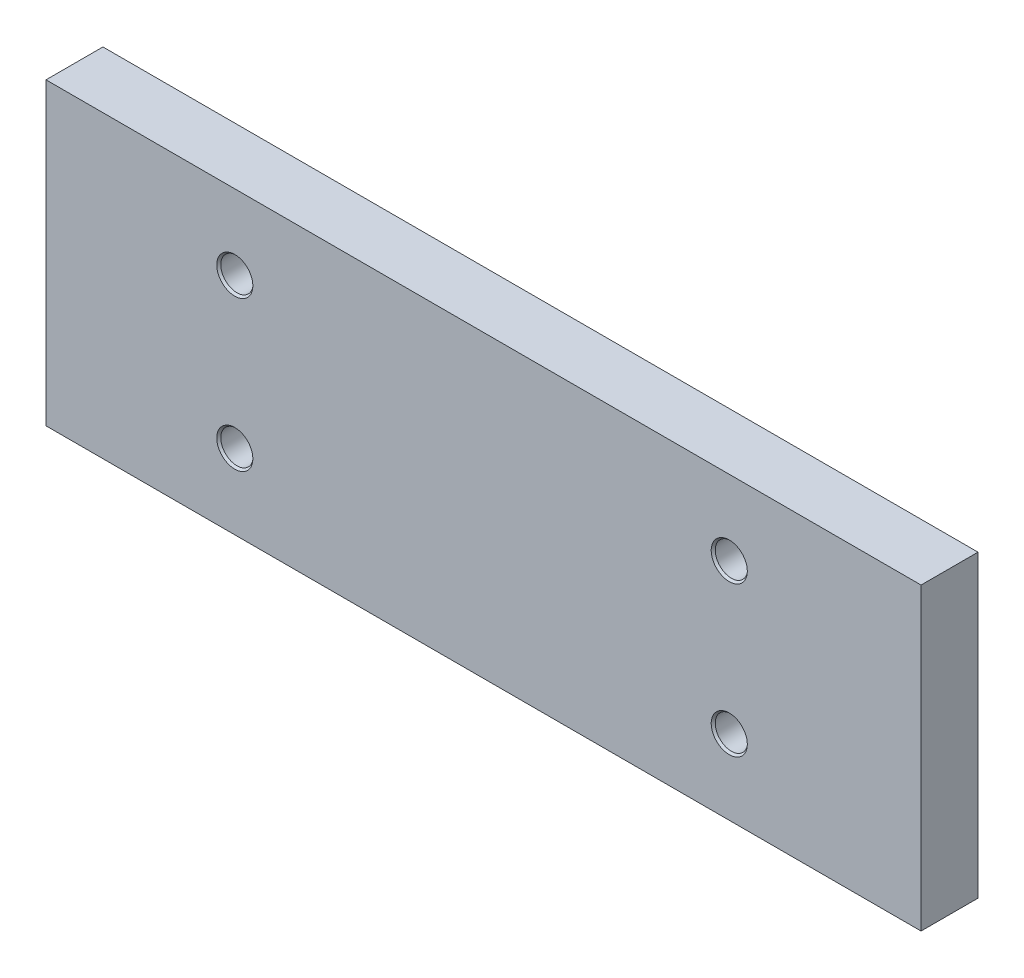
ISO-10303-21;
HEADER;
FILE_DESCRIPTION(('STEP AP214'),'2;1');
FILE_NAME('part.step','',(''),(''),'','','');
FILE_SCHEMA(('AUTOMOTIVE_DESIGN { 1 0 10303 214 1 1 1 1 }'));
ENDSEC;
DATA;
#1=APPLICATION_CONTEXT('core data for automotive mechanical design processes');
#2=APPLICATION_PROTOCOL_DEFINITION('international standard','automotive_design',2000,#1);
#3=PRODUCT_CONTEXT('',#1,'mechanical');
#4=PRODUCT('Part','Part','',(#3));
#5=PRODUCT_RELATED_PRODUCT_CATEGORY('part','',(#4));
#6=PRODUCT_DEFINITION_FORMATION('','',#4);
#7=PRODUCT_DEFINITION_CONTEXT('part definition',#1,'design');
#8=PRODUCT_DEFINITION('design','',#6,#7);
#9=PRODUCT_DEFINITION_SHAPE('','',#8);
#10=(LENGTH_UNIT() NAMED_UNIT(*) SI_UNIT(.MILLI.,.METRE.));
#11=(NAMED_UNIT(*) PLANE_ANGLE_UNIT() SI_UNIT($,.RADIAN.));
#12=(NAMED_UNIT(*) SI_UNIT($,.STERADIAN.) SOLID_ANGLE_UNIT());
#13=UNCERTAINTY_MEASURE_WITH_UNIT(LENGTH_MEASURE(1.E-05),#10,'distance_accuracy_value','');
#14=(GEOMETRIC_REPRESENTATION_CONTEXT(3) GLOBAL_UNCERTAINTY_ASSIGNED_CONTEXT((#13)) GLOBAL_UNIT_ASSIGNED_CONTEXT((#10,
#11,#12)) REPRESENTATION_CONTEXT('',''));
#15=CARTESIAN_POINT('',(0.,0.,0.));
#16=DIRECTION('',(0.,0.,1.));
#17=DIRECTION('',(1.,0.,0.));
#18=AXIS2_PLACEMENT_3D('',#15,#16,#17);
#19=CARTESIAN_POINT('',(177.207100591716,45.2662721893492,19.));
#20=DIRECTION('',(0.,-1.,0.));
#21=DIRECTION('',(1.,0.,0.));
#22=AXIS2_PLACEMENT_3D('',#19,#20,#21);
#23=PLANE('',#22);
#24=DIRECTION('',(-1.,0.,0.));
#25=VECTOR('',#24,1.);
#26=CARTESIAN_POINT('',(177.207100591716,45.2662721893492,0.));
#27=LINE('',#26,#25);
#28=CARTESIAN_POINT('',(177.207100591716,45.2662721893492,0.));
#29=VERTEX_POINT('',#28);
#30=CARTESIAN_POINT('',(-114.792899408284,45.2662721893491,0.));
#31=VERTEX_POINT('',#30);
#32=EDGE_CURVE('E111',#29,#31,#27,.T.);
#33=ORIENTED_EDGE('',*,*,#32,.T.);
#34=DIRECTION('',(0.,0.,-1.));
#35=VECTOR('',#34,1.);
#36=CARTESIAN_POINT('',(-114.792899408284,45.2662721893491,19.));
#37=LINE('',#36,#35);
#38=CARTESIAN_POINT('',(-114.792899408284,45.2662721893491,19.));
#39=VERTEX_POINT('',#38);
#40=EDGE_CURVE('E11',#39,#31,#37,.T.);
#41=ORIENTED_EDGE('',*,*,#40,.F.);
#42=DIRECTION('',(-1.,0.,0.));
#43=VECTOR('',#42,1.);
#44=CARTESIAN_POINT('',(177.207100591716,45.2662721893492,19.));
#45=LINE('',#44,#43);
#46=CARTESIAN_POINT('',(177.207100591716,45.2662721893492,19.));
#47=VERTEX_POINT('',#46);
#48=EDGE_CURVE('E95',#47,#39,#45,.T.);
#49=ORIENTED_EDGE('',*,*,#48,.F.);
#50=DIRECTION('',(0.,0.,-1.));
#51=VECTOR('',#50,1.);
#52=CARTESIAN_POINT('',(177.207100591716,45.2662721893492,19.));
#53=LINE('',#52,#51);
#54=EDGE_CURVE('E107',#47,#29,#53,.T.);
#55=ORIENTED_EDGE('',*,*,#54,.T.);
#56=EDGE_LOOP('',(#33,#41,#49,#55));
#57=FACE_BOUND('',#56,.T.);
#58=ADVANCED_FACE('F43',(#57),#23,.F.);
#59=CARTESIAN_POINT('',(-114.792899408284,45.2662721893491,19.));
#60=DIRECTION('',(1.,0.,0.));
#61=DIRECTION('',(0.,0.,-1.));
#62=AXIS2_PLACEMENT_3D('',#59,#60,#61);
#63=PLANE('',#62);
#64=DIRECTION('',(0.,-1.,0.));
#65=VECTOR('',#64,1.);
#66=CARTESIAN_POINT('',(-114.792899408284,45.2662721893491,0.));
#67=LINE('',#66,#65);
#68=CARTESIAN_POINT('',(-114.792899408284,-54.7337278106509,0.));
#69=VERTEX_POINT('',#68);
#70=EDGE_CURVE('E100',#31,#69,#67,.T.);
#71=ORIENTED_EDGE('',*,*,#70,.T.);
#72=DIRECTION('',(0.,0.,-1.));
#73=VECTOR('',#72,1.);
#74=CARTESIAN_POINT('',(-114.792899408284,-54.7337278106509,19.));
#75=LINE('',#74,#73);
#76=CARTESIAN_POINT('',(-114.792899408284,-54.7337278106509,19.));
#77=VERTEX_POINT('',#76);
#78=EDGE_CURVE('E52',#77,#69,#75,.T.);
#79=ORIENTED_EDGE('',*,*,#78,.F.);
#80=DIRECTION('',(0.,-1.,0.));
#81=VECTOR('',#80,1.);
#82=CARTESIAN_POINT('',(-114.792899408284,45.2662721893491,19.));
#83=LINE('',#82,#81);
#84=EDGE_CURVE('E90',#39,#77,#83,.T.);
#85=ORIENTED_EDGE('',*,*,#84,.F.);
#86=ORIENTED_EDGE('',*,*,#40,.T.);
#87=EDGE_LOOP('',(#71,#79,#85,#86));
#88=FACE_BOUND('',#87,.T.);
#89=ADVANCED_FACE('F99',(#88),#63,.F.);
#90=CARTESIAN_POINT('',(-114.792899408284,-54.7337278106509,19.));
#91=DIRECTION('',(0.,1.,0.));
#92=DIRECTION('',(0.,0.,1.));
#93=AXIS2_PLACEMENT_3D('',#90,#91,#92);
#94=PLANE('',#93);
#95=DIRECTION('',(1.,0.,0.));
#96=VECTOR('',#95,1.);
#97=CARTESIAN_POINT('',(-114.792899408284,-54.7337278106509,0.));
#98=LINE('',#97,#96);
#99=CARTESIAN_POINT('',(177.207100591716,-54.7337278106509,0.));
#100=VERTEX_POINT('',#99);
#101=EDGE_CURVE('E77',#69,#100,#98,.T.);
#102=ORIENTED_EDGE('',*,*,#101,.T.);
#103=DIRECTION('',(0.,0.,-1.));
#104=VECTOR('',#103,1.);
#105=CARTESIAN_POINT('',(177.207100591716,-54.7337278106509,19.));
#106=LINE('',#105,#104);
#107=CARTESIAN_POINT('',(177.207100591716,-54.7337278106509,19.));
#108=VERTEX_POINT('',#107);
#109=EDGE_CURVE('E102',#108,#100,#106,.T.);
#110=ORIENTED_EDGE('',*,*,#109,.F.);
#111=DIRECTION('',(1.,0.,0.));
#112=VECTOR('',#111,1.);
#113=CARTESIAN_POINT('',(-114.792899408284,-54.7337278106509,19.));
#114=LINE('',#113,#112);
#115=EDGE_CURVE('E93',#77,#108,#114,.T.);
#116=ORIENTED_EDGE('',*,*,#115,.F.);
#117=ORIENTED_EDGE('',*,*,#78,.T.);
#118=EDGE_LOOP('',(#102,#110,#116,#117));
#119=FACE_BOUND('',#118,.T.);
#120=ADVANCED_FACE('F103',(#119),#94,.F.);
#121=CARTESIAN_POINT('',(177.207100591716,-54.7337278106509,19.));
#122=DIRECTION('',(-1.,0.,0.));
#123=DIRECTION('',(0.,0.,1.));
#124=AXIS2_PLACEMENT_3D('',#121,#122,#123);
#125=PLANE('',#124);
#126=DIRECTION('',(0.,1.,0.));
#127=VECTOR('',#126,1.);
#128=CARTESIAN_POINT('',(177.207100591716,-54.7337278106509,0.));
#129=LINE('',#128,#127);
#130=EDGE_CURVE('E83',#100,#29,#129,.T.);
#131=ORIENTED_EDGE('',*,*,#130,.T.);
#132=ORIENTED_EDGE('',*,*,#54,.F.);
#133=DIRECTION('',(0.,1.,0.));
#134=VECTOR('',#133,1.);
#135=CARTESIAN_POINT('',(177.207100591716,-54.7337278106509,19.));
#136=LINE('',#135,#134);
#137=EDGE_CURVE('E60',#108,#47,#136,.T.);
#138=ORIENTED_EDGE('',*,*,#137,.F.);
#139=ORIENTED_EDGE('',*,*,#109,.T.);
#140=EDGE_LOOP('',(#131,#132,#138,#139));
#141=FACE_BOUND('',#140,.T.);
#142=ADVANCED_FACE('F125',(#141),#125,.F.);
#143=CARTESIAN_POINT('',(0.,0.,19.));
#144=DIRECTION('',(0.,0.,1.));
#145=DIRECTION('',(1.,0.,0.));
#146=AXIS2_PLACEMENT_3D('',#143,#144,#145);
#147=PLANE('',#146);
#148=CARTESIAN_POINT('',(-51.792899408284,20.2662721893491,19.));
#149=DIRECTION('',(0.,0.,1.));
#150=DIRECTION('',(1.,0.,0.));
#151=AXIS2_PLACEMENT_3D('',#148,#149,#150);
#152=CIRCLE('',#151,6.025);
#153=CARTESIAN_POINT('',(-45.767899408284,20.2662721893491,19.));
#154=VERTEX_POINT('',#153);
#155=EDGE_CURVE('E175',#154,#154,#152,.T.);
#156=ORIENTED_EDGE('',*,*,#155,.F.);
#157=EDGE_LOOP('',(#156));
#158=FACE_BOUND('',#157,.T.);
#159=CARTESIAN_POINT('',(-51.792899408284,-29.7337278106509,19.));
#160=DIRECTION('',(0.,0.,1.));
#161=DIRECTION('',(1.,0.,0.));
#162=AXIS2_PLACEMENT_3D('',#159,#160,#161);
#163=CIRCLE('',#162,6.025);
#164=CARTESIAN_POINT('',(-45.767899408284,-29.7337278106509,19.));
#165=VERTEX_POINT('',#164);
#166=EDGE_CURVE('E163',#165,#165,#163,.T.);
#167=ORIENTED_EDGE('',*,*,#166,.F.);
#168=EDGE_LOOP('',(#167));
#169=FACE_BOUND('',#168,.T.);
#170=CARTESIAN_POINT('',(113.207100591716,-29.7337278106509,19.));
#171=DIRECTION('',(0.,0.,1.));
#172=DIRECTION('',(1.,0.,0.));
#173=AXIS2_PLACEMENT_3D('',#170,#171,#172);
#174=CIRCLE('',#173,6.025);
#175=CARTESIAN_POINT('',(119.232100591716,-29.7337278106509,19.));
#176=VERTEX_POINT('',#175);
#177=EDGE_CURVE('E151',#176,#176,#174,.T.);
#178=ORIENTED_EDGE('',*,*,#177,.F.);
#179=EDGE_LOOP('',(#178));
#180=FACE_BOUND('',#179,.T.);
#181=CARTESIAN_POINT('',(113.207100591716,20.2662721893491,19.));
#182=DIRECTION('',(0.,0.,1.));
#183=DIRECTION('',(1.,0.,0.));
#184=AXIS2_PLACEMENT_3D('',#181,#182,#183);
#185=CIRCLE('',#184,6.025);
#186=CARTESIAN_POINT('',(119.232100591716,20.2662721893491,19.));
#187=VERTEX_POINT('',#186);
#188=EDGE_CURVE('E139',#187,#187,#185,.T.);
#189=ORIENTED_EDGE('',*,*,#188,.F.);
#190=EDGE_LOOP('',(#189));
#191=FACE_BOUND('',#190,.T.);
#192=ORIENTED_EDGE('',*,*,#48,.T.);
#193=ORIENTED_EDGE('',*,*,#84,.T.);
#194=ORIENTED_EDGE('',*,*,#115,.T.);
#195=ORIENTED_EDGE('',*,*,#137,.T.);
#196=EDGE_LOOP('',(#192,#193,#194,#195));
#197=FACE_BOUND('',#196,.T.);
#198=ADVANCED_FACE('F91',(#158,#169,#180,#191,#197),#147,.T.);
#199=CARTESIAN_POINT('',(0.,0.,0.));
#200=DIRECTION('',(0.,0.,1.));
#201=DIRECTION('',(1.,0.,0.));
#202=AXIS2_PLACEMENT_3D('',#199,#200,#201);
#203=PLANE('',#202);
#204=CARTESIAN_POINT('',(-51.792899408284,20.2662721893491,0.));
#205=DIRECTION('',(0.,0.,1.));
#206=DIRECTION('',(1.,0.,0.));
#207=AXIS2_PLACEMENT_3D('',#204,#205,#206);
#208=CIRCLE('',#207,5.4);
#209=CARTESIAN_POINT('',(-46.392899408284,20.2662721893491,0.));
#210=VERTEX_POINT('',#209);
#211=EDGE_CURVE('E167',#210,#210,#208,.T.);
#212=ORIENTED_EDGE('',*,*,#211,.T.);
#213=EDGE_LOOP('',(#212));
#214=FACE_BOUND('',#213,.T.);
#215=CARTESIAN_POINT('',(-51.792899408284,-29.7337278106509,0.));
#216=DIRECTION('',(0.,0.,1.));
#217=DIRECTION('',(1.,0.,0.));
#218=AXIS2_PLACEMENT_3D('',#215,#216,#217);
#219=CIRCLE('',#218,5.4);
#220=CARTESIAN_POINT('',(-46.392899408284,-29.7337278106509,0.));
#221=VERTEX_POINT('',#220);
#222=EDGE_CURVE('E155',#221,#221,#219,.T.);
#223=ORIENTED_EDGE('',*,*,#222,.T.);
#224=EDGE_LOOP('',(#223));
#225=FACE_BOUND('',#224,.T.);
#226=CARTESIAN_POINT('',(113.207100591716,-29.7337278106509,0.));
#227=DIRECTION('',(0.,0.,1.));
#228=DIRECTION('',(1.,0.,0.));
#229=AXIS2_PLACEMENT_3D('',#226,#227,#228);
#230=CIRCLE('',#229,5.4);
#231=CARTESIAN_POINT('',(118.607100591716,-29.7337278106509,0.));
#232=VERTEX_POINT('',#231);
#233=EDGE_CURVE('E143',#232,#232,#230,.T.);
#234=ORIENTED_EDGE('',*,*,#233,.T.);
#235=EDGE_LOOP('',(#234));
#236=FACE_BOUND('',#235,.T.);
#237=CARTESIAN_POINT('',(113.207100591716,20.2662721893491,0.));
#238=DIRECTION('',(0.,0.,1.));
#239=DIRECTION('',(1.,0.,0.));
#240=AXIS2_PLACEMENT_3D('',#237,#238,#239);
#241=CIRCLE('',#240,5.4);
#242=CARTESIAN_POINT('',(118.607100591716,20.2662721893491,0.));
#243=VERTEX_POINT('',#242);
#244=EDGE_CURVE('E115',#243,#243,#241,.T.);
#245=ORIENTED_EDGE('',*,*,#244,.T.);
#246=EDGE_LOOP('',(#245));
#247=FACE_BOUND('',#246,.T.);
#248=ORIENTED_EDGE('',*,*,#32,.F.);
#249=ORIENTED_EDGE('',*,*,#130,.F.);
#250=ORIENTED_EDGE('',*,*,#101,.F.);
#251=ORIENTED_EDGE('',*,*,#70,.F.);
#252=EDGE_LOOP('',(#248,#249,#250,#251));
#253=FACE_BOUND('',#252,.T.);
#254=ADVANCED_FACE('F128',(#214,#225,#236,#247,#253),#203,.F.);
#255=CARTESIAN_POINT('',(113.207100591716,20.2662721893491,19.));
#256=DIRECTION('',(0.,0.,1.));
#257=DIRECTION('',(1.,0.,0.));
#258=AXIS2_PLACEMENT_3D('',#255,#256,#257);
#259=CYLINDRICAL_SURFACE('',#258,5.4);
#260=ORIENTED_EDGE('',*,*,#244,.F.);
#261=EDGE_LOOP('',(#260));
#262=FACE_BOUND('',#261,.T.);
#263=CARTESIAN_POINT('',(113.207100591716,20.2662721893491,18.2810197454869));
#264=DIRECTION('',(0.,0.,1.));
#265=DIRECTION('',(1.,0.,0.));
#266=AXIS2_PLACEMENT_3D('',#263,#264,#265);
#267=CIRCLE('',#266,5.4);
#268=CARTESIAN_POINT('',(118.607100591716,20.2662721893491,18.2810197454869));
#269=VERTEX_POINT('',#268);
#270=EDGE_CURVE('E135',#269,#269,#267,.T.);
#271=ORIENTED_EDGE('',*,*,#270,.T.);
#272=EDGE_LOOP('',(#271));
#273=FACE_BOUND('',#272,.T.);
#274=ADVANCED_FACE('F194',(#262,#273),#259,.F.);
#275=CARTESIAN_POINT('',(113.207100591716,20.2662721893491,19.));
#276=DIRECTION('',(0.,0.,1.));
#277=DIRECTION('',(1.,0.,0.));
#278=AXIS2_PLACEMENT_3D('',#275,#276,#277);
#279=CONICAL_SURFACE('',#278,6.025,0.715584993317676);
#280=ORIENTED_EDGE('',*,*,#270,.F.);
#281=EDGE_LOOP('',(#280));
#282=FACE_BOUND('',#281,.T.);
#283=ORIENTED_EDGE('',*,*,#188,.T.);
#284=EDGE_LOOP('',(#283));
#285=FACE_BOUND('',#284,.T.);
#286=ADVANCED_FACE('F191',(#282,#285),#279,.F.);
#287=CARTESIAN_POINT('',(113.207100591716,-29.7337278106509,19.));
#288=DIRECTION('',(0.,0.,1.));
#289=DIRECTION('',(1.,0.,0.));
#290=AXIS2_PLACEMENT_3D('',#287,#288,#289);
#291=CYLINDRICAL_SURFACE('',#290,5.4);
#292=ORIENTED_EDGE('',*,*,#233,.F.);
#293=EDGE_LOOP('',(#292));
#294=FACE_BOUND('',#293,.T.);
#295=CARTESIAN_POINT('',(113.207100591716,-29.7337278106509,18.2810197454869));
#296=DIRECTION('',(0.,0.,1.));
#297=DIRECTION('',(1.,0.,0.));
#298=AXIS2_PLACEMENT_3D('',#295,#296,#297);
#299=CIRCLE('',#298,5.4);
#300=CARTESIAN_POINT('',(118.607100591716,-29.7337278106509,18.2810197454869));
#301=VERTEX_POINT('',#300);
#302=EDGE_CURVE('E147',#301,#301,#299,.T.);
#303=ORIENTED_EDGE('',*,*,#302,.T.);
#304=EDGE_LOOP('',(#303));
#305=FACE_BOUND('',#304,.T.);
#306=ADVANCED_FACE('F193',(#294,#305),#291,.F.);
#307=CARTESIAN_POINT('',(113.207100591716,-29.7337278106509,19.));
#308=DIRECTION('',(0.,0.,1.));
#309=DIRECTION('',(1.,0.,0.));
#310=AXIS2_PLACEMENT_3D('',#307,#308,#309);
#311=CONICAL_SURFACE('',#310,6.025,0.715584993317676);
#312=ORIENTED_EDGE('',*,*,#302,.F.);
#313=EDGE_LOOP('',(#312));
#314=FACE_BOUND('',#313,.T.);
#315=ORIENTED_EDGE('',*,*,#177,.T.);
#316=EDGE_LOOP('',(#315));
#317=FACE_BOUND('',#316,.T.);
#318=ADVANCED_FACE('F201',(#314,#317),#311,.F.);
#319=CARTESIAN_POINT('',(-51.792899408284,-29.7337278106509,19.));
#320=DIRECTION('',(0.,0.,1.));
#321=DIRECTION('',(1.,0.,0.));
#322=AXIS2_PLACEMENT_3D('',#319,#320,#321);
#323=CYLINDRICAL_SURFACE('',#322,5.4);
#324=ORIENTED_EDGE('',*,*,#222,.F.);
#325=EDGE_LOOP('',(#324));
#326=FACE_BOUND('',#325,.T.);
#327=CARTESIAN_POINT('',(-51.792899408284,-29.7337278106509,18.2810197454869));
#328=DIRECTION('',(0.,0.,1.));
#329=DIRECTION('',(1.,0.,0.));
#330=AXIS2_PLACEMENT_3D('',#327,#328,#329);
#331=CIRCLE('',#330,5.4);
#332=CARTESIAN_POINT('',(-46.392899408284,-29.7337278106509,18.2810197454869));
#333=VERTEX_POINT('',#332);
#334=EDGE_CURVE('E159',#333,#333,#331,.T.);
#335=ORIENTED_EDGE('',*,*,#334,.T.);
#336=EDGE_LOOP('',(#335));
#337=FACE_BOUND('',#336,.T.);
#338=ADVANCED_FACE('F235',(#326,#337),#323,.F.);
#339=CARTESIAN_POINT('',(-51.792899408284,-29.7337278106509,19.));
#340=DIRECTION('',(0.,0.,1.));
#341=DIRECTION('',(1.,0.,0.));
#342=AXIS2_PLACEMENT_3D('',#339,#340,#341);
#343=CONICAL_SURFACE('',#342,6.025,0.715584993317676);
#344=ORIENTED_EDGE('',*,*,#334,.F.);
#345=EDGE_LOOP('',(#344));
#346=FACE_BOUND('',#345,.T.);
#347=ORIENTED_EDGE('',*,*,#166,.T.);
#348=EDGE_LOOP('',(#347));
#349=FACE_BOUND('',#348,.T.);
#350=ADVANCED_FACE('F240',(#346,#349),#343,.F.);
#351=CARTESIAN_POINT('',(-51.792899408284,20.2662721893491,19.));
#352=DIRECTION('',(0.,0.,1.));
#353=DIRECTION('',(1.,0.,0.));
#354=AXIS2_PLACEMENT_3D('',#351,#352,#353);
#355=CYLINDRICAL_SURFACE('',#354,5.4);
#356=ORIENTED_EDGE('',*,*,#211,.F.);
#357=EDGE_LOOP('',(#356));
#358=FACE_BOUND('',#357,.T.);
#359=CARTESIAN_POINT('',(-51.792899408284,20.2662721893491,18.2810197454869));
#360=DIRECTION('',(0.,0.,1.));
#361=DIRECTION('',(1.,0.,0.));
#362=AXIS2_PLACEMENT_3D('',#359,#360,#361);
#363=CIRCLE('',#362,5.4);
#364=CARTESIAN_POINT('',(-46.392899408284,20.2662721893491,18.2810197454869));
#365=VERTEX_POINT('',#364);
#366=EDGE_CURVE('E171',#365,#365,#363,.T.);
#367=ORIENTED_EDGE('',*,*,#366,.T.);
#368=EDGE_LOOP('',(#367));
#369=FACE_BOUND('',#368,.T.);
#370=ADVANCED_FACE('F246',(#358,#369),#355,.F.);
#371=CARTESIAN_POINT('',(-51.792899408284,20.2662721893491,19.));
#372=DIRECTION('',(0.,0.,1.));
#373=DIRECTION('',(1.,0.,0.));
#374=AXIS2_PLACEMENT_3D('',#371,#372,#373);
#375=CONICAL_SURFACE('',#374,6.025,0.715584993317676);
#376=ORIENTED_EDGE('',*,*,#366,.F.);
#377=EDGE_LOOP('',(#376));
#378=FACE_BOUND('',#377,.T.);
#379=ORIENTED_EDGE('',*,*,#155,.T.);
#380=EDGE_LOOP('',(#379));
#381=FACE_BOUND('',#380,.T.);
#382=ADVANCED_FACE('F180',(#378,#381),#375,.F.);
#383=CLOSED_SHELL('',(#58,#89,#120,#142,#198,#254,#274,#286,#306,#318,#338,#350,#370,#382));
#384=MANIFOLD_SOLID_BREP('B2',#383);
#385=ADVANCED_BREP_SHAPE_REPRESENTATION('',(#18,#384),#14);
#386=SHAPE_DEFINITION_REPRESENTATION(#9,#385);
ENDSEC;
END-ISO-10303-21;
